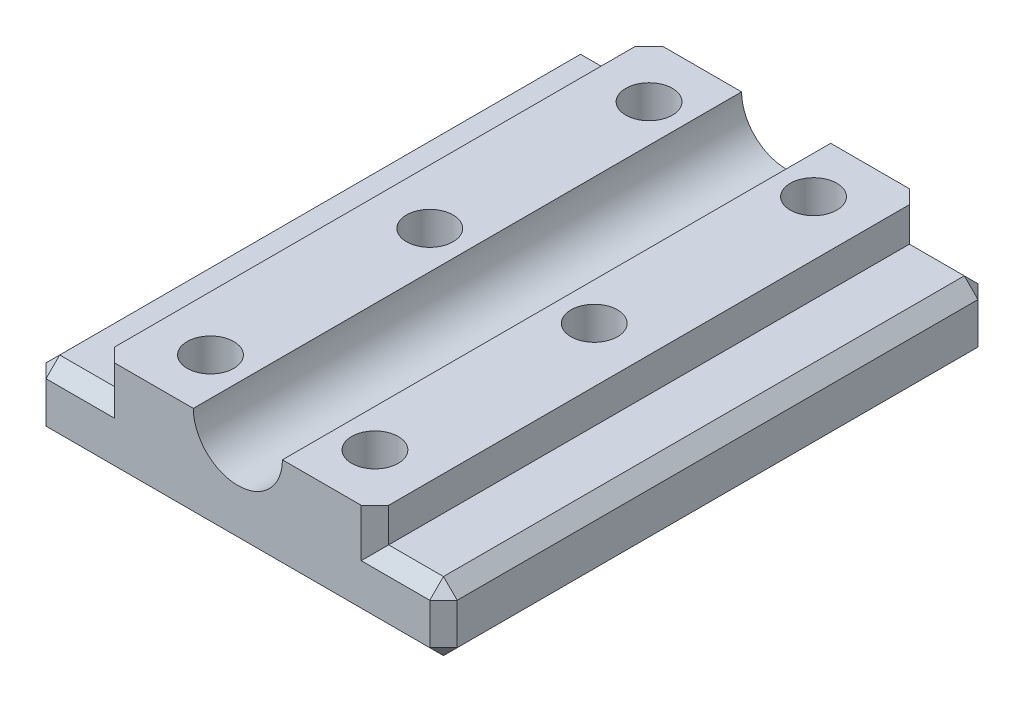
ISO-10303-21;
HEADER;
FILE_DESCRIPTION(('STEP AP214'),'2;1');
FILE_NAME('part.step','',(''),(''),'','','');
FILE_SCHEMA(('AUTOMOTIVE_DESIGN { 1 0 10303 214 1 1 1 1 }'));
ENDSEC;
DATA;
#1=APPLICATION_CONTEXT('core data for automotive mechanical design processes');
#2=APPLICATION_PROTOCOL_DEFINITION('international standard','automotive_design',2000,#1);
#3=PRODUCT_CONTEXT('',#1,'mechanical');
#4=PRODUCT('Part','Part','',(#3));
#5=PRODUCT_RELATED_PRODUCT_CATEGORY('part','',(#4));
#6=PRODUCT_DEFINITION_FORMATION('','',#4);
#7=PRODUCT_DEFINITION_CONTEXT('part definition',#1,'design');
#8=PRODUCT_DEFINITION('design','',#6,#7);
#9=PRODUCT_DEFINITION_SHAPE('','',#8);
#10=(LENGTH_UNIT() NAMED_UNIT(*) SI_UNIT(.MILLI.,.METRE.));
#11=(NAMED_UNIT(*) PLANE_ANGLE_UNIT() SI_UNIT($,.RADIAN.));
#12=(NAMED_UNIT(*) SI_UNIT($,.STERADIAN.) SOLID_ANGLE_UNIT());
#13=UNCERTAINTY_MEASURE_WITH_UNIT(LENGTH_MEASURE(1.E-05),#10,'distance_accuracy_value','');
#14=(GEOMETRIC_REPRESENTATION_CONTEXT(3) GLOBAL_UNCERTAINTY_ASSIGNED_CONTEXT((#13)) GLOBAL_UNIT_ASSIGNED_CONTEXT((#10,
#11,#12)) REPRESENTATION_CONTEXT('',''));
#15=CARTESIAN_POINT('',(0.,0.,0.));
#16=DIRECTION('',(0.,0.,1.));
#17=DIRECTION('',(1.,0.,0.));
#18=AXIS2_PLACEMENT_3D('',#15,#16,#17);
#19=CARTESIAN_POINT('',(0.,0.,0.));
#20=DIRECTION('',(0.,1.,0.));
#21=DIRECTION('',(0.,0.,1.));
#22=AXIS2_PLACEMENT_3D('',#19,#20,#21);
#23=PLANE('',#22);
#24=CARTESIAN_POINT('',(6.,0.,36.));
#25=DIRECTION('',(0.,1.,0.));
#26=DIRECTION('',(0.,0.,1.));
#27=AXIS2_PLACEMENT_3D('',#24,#25,#26);
#28=CIRCLE('',#27,1.7);
#29=CARTESIAN_POINT('',(6.,0.,37.7));
#30=VERTEX_POINT('',#29);
#31=EDGE_CURVE('E264',#30,#30,#28,.F.);
#32=ORIENTED_EDGE('',*,*,#31,.T.);
#33=EDGE_LOOP('',(#32));
#34=FACE_BOUND('',#33,.T.);
#35=CARTESIAN_POINT('',(6.,0.,4.));
#36=DIRECTION('',(0.,1.,0.));
#37=DIRECTION('',(0.,0.,1.));
#38=AXIS2_PLACEMENT_3D('',#35,#36,#37);
#39=CIRCLE('',#38,1.7);
#40=CARTESIAN_POINT('',(6.,0.,5.7));
#41=VERTEX_POINT('',#40);
#42=EDGE_CURVE('E252',#41,#41,#39,.F.);
#43=ORIENTED_EDGE('',*,*,#42,.T.);
#44=EDGE_LOOP('',(#43));
#45=FACE_BOUND('',#44,.T.);
#46=DIRECTION('',(0.,0.,-1.));
#47=VECTOR('',#46,1.);
#48=CARTESIAN_POINT('',(3.25,0.,40.));
#49=LINE('',#48,#47);
#50=CARTESIAN_POINT('',(3.25,0.,40.));
#51=VERTEX_POINT('',#50);
#52=CARTESIAN_POINT('',(3.25,0.,0.));
#53=VERTEX_POINT('',#52);
#54=EDGE_CURVE('E211',#51,#53,#49,.T.);
#55=ORIENTED_EDGE('',*,*,#54,.F.);
#56=DIRECTION('',(1.,0.,0.));
#57=VECTOR('',#56,1.);
#58=CARTESIAN_POINT('',(0.,0.,40.));
#59=LINE('',#58,#57);
#60=CARTESIAN_POINT('',(9.,0.,40.));
#61=VERTEX_POINT('',#60);
#62=EDGE_CURVE('E273',#51,#61,#59,.T.);
#63=ORIENTED_EDGE('',*,*,#62,.T.);
#64=DIRECTION('',(0.707106781186548,0.,-0.707106781186548));
#65=VECTOR('',#64,1.);
#66=CARTESIAN_POINT('',(9.,0.,40.));
#67=LINE('',#66,#65);
#68=CARTESIAN_POINT('',(10.,0.,39.));
#69=VERTEX_POINT('',#68);
#70=EDGE_CURVE('E210',#69,#61,#67,.F.);
#71=ORIENTED_EDGE('',*,*,#70,.F.);
#72=DIRECTION('',(0.,0.,-1.));
#73=VECTOR('',#72,1.);
#74=CARTESIAN_POINT('',(10.,0.,40.));
#75=LINE('',#74,#73);
#76=CARTESIAN_POINT('',(10.,0.,0.999999999999994));
#77=VERTEX_POINT('',#76);
#78=EDGE_CURVE('E220',#69,#77,#75,.T.);
#79=ORIENTED_EDGE('',*,*,#78,.T.);
#80=DIRECTION('',(0.707106781186548,0.,0.707106781186548));
#81=VECTOR('',#80,1.);
#82=CARTESIAN_POINT('',(10.,0.,0.999999999999994));
#83=LINE('',#82,#81);
#84=CARTESIAN_POINT('',(9.,0.,0.));
#85=VERTEX_POINT('',#84);
#86=EDGE_CURVE('E280',#85,#77,#83,.T.);
#87=ORIENTED_EDGE('',*,*,#86,.F.);
#88=DIRECTION('',(1.,0.,0.));
#89=VECTOR('',#88,1.);
#90=CARTESIAN_POINT('',(0.,0.,0.));
#91=LINE('',#90,#89);
#92=EDGE_CURVE('E219',#53,#85,#91,.T.);
#93=ORIENTED_EDGE('',*,*,#92,.F.);
#94=EDGE_LOOP('',(#55,#63,#71,#79,#87,#93));
#95=FACE_BOUND('',#94,.T.);
#96=CARTESIAN_POINT('',(6.,0.,20.));
#97=DIRECTION('',(0.,1.,0.));
#98=DIRECTION('',(0.,0.,1.));
#99=AXIS2_PLACEMENT_3D('',#96,#97,#98);
#100=CIRCLE('',#99,1.7);
#101=CARTESIAN_POINT('',(6.,0.,21.7));
#102=VERTEX_POINT('',#101);
#103=EDGE_CURVE('E258',#102,#102,#100,.F.);
#104=ORIENTED_EDGE('',*,*,#103,.T.);
#105=EDGE_LOOP('',(#104));
#106=FACE_BOUND('',#105,.T.);
#107=ADVANCED_FACE('F45',(#34,#45,#95,#106),#23,.T.);
#108=CARTESIAN_POINT('',(-6.,0.,36.));
#109=DIRECTION('',(0.,1.,0.));
#110=DIRECTION('',(0.,0.,1.));
#111=AXIS2_PLACEMENT_3D('',#108,#109,#110);
#112=CIRCLE('',#111,1.7);
#113=CARTESIAN_POINT('',(-6.,0.,37.7));
#114=VERTEX_POINT('',#113);
#115=EDGE_CURVE('E267',#114,#114,#112,.F.);
#116=ORIENTED_EDGE('',*,*,#115,.T.);
#117=EDGE_LOOP('',(#116));
#118=FACE_BOUND('',#117,.T.);
#119=CARTESIAN_POINT('',(-6.,0.,4.));
#120=DIRECTION('',(0.,1.,0.));
#121=DIRECTION('',(0.,0.,1.));
#122=AXIS2_PLACEMENT_3D('',#119,#120,#121);
#123=CIRCLE('',#122,1.7);
#124=CARTESIAN_POINT('',(-6.,0.,5.7));
#125=VERTEX_POINT('',#124);
#126=EDGE_CURVE('E255',#125,#125,#123,.F.);
#127=ORIENTED_EDGE('',*,*,#126,.T.);
#128=EDGE_LOOP('',(#127));
#129=FACE_BOUND('',#128,.T.);
#130=DIRECTION('',(0.707106781186548,0.,0.707106781186548));
#131=VECTOR('',#130,1.);
#132=CARTESIAN_POINT('',(-9.00000000000001,0.,40.));
#133=LINE('',#132,#131);
#134=CARTESIAN_POINT('',(-9.00000000000001,0.,40.));
#135=VERTEX_POINT('',#134);
#136=CARTESIAN_POINT('',(-10.,0.,39.));
#137=VERTEX_POINT('',#136);
#138=EDGE_CURVE('E282',#135,#137,#133,.F.);
#139=ORIENTED_EDGE('',*,*,#138,.F.);
#140=CARTESIAN_POINT('',(-3.25,0.,40.));
#141=VERTEX_POINT('',#140);
#142=EDGE_CURVE('E205',#135,#141,#59,.T.);
#143=ORIENTED_EDGE('',*,*,#142,.T.);
#144=DIRECTION('',(0.,0.,-1.));
#145=VECTOR('',#144,1.);
#146=CARTESIAN_POINT('',(-3.25,0.,40.));
#147=LINE('',#146,#145);
#148=CARTESIAN_POINT('',(-3.25,0.,0.));
#149=VERTEX_POINT('',#148);
#150=EDGE_CURVE('E198',#149,#141,#147,.F.);
#151=ORIENTED_EDGE('',*,*,#150,.F.);
#152=CARTESIAN_POINT('',(-9.00000000000001,0.,0.));
#153=VERTEX_POINT('',#152);
#154=EDGE_CURVE('E202',#153,#149,#91,.T.);
#155=ORIENTED_EDGE('',*,*,#154,.F.);
#156=DIRECTION('',(0.707106781186548,0.,-0.707106781186548));
#157=VECTOR('',#156,1.);
#158=CARTESIAN_POINT('',(-10.,0.,0.999999999999994));
#159=LINE('',#158,#157);
#160=CARTESIAN_POINT('',(-10.,0.,0.999999999999994));
#161=VERTEX_POINT('',#160);
#162=EDGE_CURVE('E284',#161,#153,#159,.T.);
#163=ORIENTED_EDGE('',*,*,#162,.F.);
#164=DIRECTION('',(0.,0.,1.));
#165=VECTOR('',#164,1.);
#166=CARTESIAN_POINT('',(-10.,0.,40.));
#167=LINE('',#166,#165);
#168=EDGE_CURVE('E270',#161,#137,#167,.T.);
#169=ORIENTED_EDGE('',*,*,#168,.T.);
#170=EDGE_LOOP('',(#139,#143,#151,#155,#163,#169));
#171=FACE_BOUND('',#170,.T.);
#172=CARTESIAN_POINT('',(-6.,0.,20.));
#173=DIRECTION('',(0.,1.,0.));
#174=DIRECTION('',(0.,0.,1.));
#175=AXIS2_PLACEMENT_3D('',#172,#173,#174);
#176=CIRCLE('',#175,1.7);
#177=CARTESIAN_POINT('',(-6.,0.,21.7));
#178=VERTEX_POINT('',#177);
#179=EDGE_CURVE('E261',#178,#178,#176,.F.);
#180=ORIENTED_EDGE('',*,*,#179,.T.);
#181=EDGE_LOOP('',(#180));
#182=FACE_BOUND('',#181,.T.);
#183=ADVANCED_FACE('F200',(#118,#129,#171,#182),#23,.T.);
#184=CARTESIAN_POINT('',(15.,-3.49999999999999,-7.07106781186548));
#185=DIRECTION('',(-0.707106781186547,-0.707106781186547,0.));
#186=DIRECTION('',(0.,0.,1.));
#187=AXIS2_PLACEMENT_3D('',#184,#185,#186);
#188=PLANE('',#187);
#189=DIRECTION('',(0.707106781186547,-0.707106781186547,0.));
#190=VECTOR('',#189,1.);
#191=CARTESIAN_POINT('',(14.5,-3.,39.));
#192=LINE('',#191,#190);
#193=CARTESIAN_POINT('',(14.,-2.5,39.));
#194=VERTEX_POINT('',#193);
#195=CARTESIAN_POINT('',(15.,-3.49999999999999,39.));
#196=VERTEX_POINT('',#195);
#197=EDGE_CURVE('E427',#194,#196,#192,.T.);
#198=ORIENTED_EDGE('',*,*,#197,.T.);
#199=DIRECTION('',(0.,0.,1.));
#200=VECTOR('',#199,1.);
#201=CARTESIAN_POINT('',(15.,-3.49999999999999,-7.07106781186548));
#202=LINE('',#201,#200);
#203=CARTESIAN_POINT('',(15.,-3.49999999999999,0.999999999999994));
#204=VERTEX_POINT('',#203);
#205=EDGE_CURVE('E251',#204,#196,#202,.T.);
#206=ORIENTED_EDGE('',*,*,#205,.F.);
#207=DIRECTION('',(-0.707106781186547,0.707106781186547,0.));
#208=VECTOR('',#207,1.);
#209=CARTESIAN_POINT('',(15.,-3.49999999999999,0.999999999999994));
#210=LINE('',#209,#208);
#211=CARTESIAN_POINT('',(14.,-2.5,0.999999999999994));
#212=VERTEX_POINT('',#211);
#213=EDGE_CURVE('E413',#212,#204,#210,.F.);
#214=ORIENTED_EDGE('',*,*,#213,.F.);
#215=DIRECTION('',(0.,0.,-1.));
#216=VECTOR('',#215,1.);
#217=CARTESIAN_POINT('',(14.,-2.5,-7.07106781186548));
#218=LINE('',#217,#216);
#219=EDGE_CURVE('E333',#194,#212,#218,.T.);
#220=ORIENTED_EDGE('',*,*,#219,.F.);
#221=EDGE_LOOP('',(#198,#206,#214,#220));
#222=FACE_BOUND('',#221,.T.);
#223=ADVANCED_FACE('F446',(#222),#188,.F.);
#224=CARTESIAN_POINT('',(14.,-6.50000000000001,40.));
#225=DIRECTION('',(0.577350269189626,-0.577350269189625,0.577350269189626));
#226=DIRECTION('',(0.707106781186548,0.,-0.707106781186548));
#227=AXIS2_PLACEMENT_3D('',#224,#225,#226);
#228=PLANE('',#227);
#229=DIRECTION('',(0.707106781186547,0.707106781186548,0.));
#230=VECTOR('',#229,1.);
#231=CARTESIAN_POINT('',(14.5,-7.,39.));
#232=LINE('',#231,#230);
#233=CARTESIAN_POINT('',(15.,-6.50000000000001,39.));
#234=VERTEX_POINT('',#233);
#235=CARTESIAN_POINT('',(14.,-7.5,39.));
#236=VERTEX_POINT('',#235);
#237=EDGE_CURVE('E418',#234,#236,#232,.F.);
#238=ORIENTED_EDGE('',*,*,#237,.F.);
#239=DIRECTION('',(-0.707106781186547,0.,0.707106781186547));
#240=VECTOR('',#239,1.);
#241=CARTESIAN_POINT('',(14.,-6.50000000000001,40.));
#242=LINE('',#241,#240);
#243=CARTESIAN_POINT('',(14.,-6.50000000000001,40.));
#244=VERTEX_POINT('',#243);
#245=EDGE_CURVE('E430',#234,#244,#242,.T.);
#246=ORIENTED_EDGE('',*,*,#245,.T.);
#247=DIRECTION('',(0.,0.707106781186547,0.707106781186547));
#248=VECTOR('',#247,1.);
#249=CARTESIAN_POINT('',(14.,-6.50000000000001,40.));
#250=LINE('',#249,#248);
#251=EDGE_CURVE('E421',#236,#244,#250,.T.);
#252=ORIENTED_EDGE('',*,*,#251,.F.);
#253=EDGE_LOOP('',(#238,#246,#252));
#254=FACE_BOUND('',#253,.T.);
#255=ADVANCED_FACE('F467',(#254),#228,.T.);
#256=CARTESIAN_POINT('',(-15.,-6.50000000000001,39.));
#257=DIRECTION('',(-0.577350269189626,-0.577350269189626,0.577350269189626));
#258=DIRECTION('',(0.707106781186547,0.,0.707106781186547));
#259=AXIS2_PLACEMENT_3D('',#256,#257,#258);
#260=PLANE('',#259);
#261=DIRECTION('',(-0.707106781186547,0.707106781186547,0.));
#262=VECTOR('',#261,1.);
#263=CARTESIAN_POINT('',(-15.,-6.50000000000001,39.));
#264=LINE('',#263,#262);
#265=CARTESIAN_POINT('',(-14.,-7.5,39.));
#266=VERTEX_POINT('',#265);
#267=CARTESIAN_POINT('',(-15.,-6.50000000000001,39.));
#268=VERTEX_POINT('',#267);
#269=EDGE_CURVE('E392',#266,#268,#264,.T.);
#270=ORIENTED_EDGE('',*,*,#269,.F.);
#271=DIRECTION('',(0.,-0.707106781186547,-0.707106781186547));
#272=VECTOR('',#271,1.);
#273=CARTESIAN_POINT('',(-14.,-7.,39.5));
#274=LINE('',#273,#272);
#275=CARTESIAN_POINT('',(-14.,-6.50000000000001,40.));
#276=VERTEX_POINT('',#275);
#277=EDGE_CURVE('E407',#266,#276,#274,.F.);
#278=ORIENTED_EDGE('',*,*,#277,.T.);
#279=DIRECTION('',(0.707106781186547,0.,0.707106781186547));
#280=VECTOR('',#279,1.);
#281=CARTESIAN_POINT('',(-15.,-6.50000000000001,39.));
#282=LINE('',#281,#280);
#283=EDGE_CURVE('E395',#268,#276,#282,.T.);
#284=ORIENTED_EDGE('',*,*,#283,.F.);
#285=EDGE_LOOP('',(#270,#278,#284));
#286=FACE_BOUND('',#285,.T.);
#287=ADVANCED_FACE('F527',(#286),#260,.T.);
#288=CARTESIAN_POINT('',(-15.,-7.5,-7.07106781186548));
#289=DIRECTION('',(1.,0.,0.));
#290=DIRECTION('',(0.,0.,-1.));
#291=AXIS2_PLACEMENT_3D('',#288,#289,#290);
#292=PLANE('',#291);
#293=DIRECTION('',(0.,0.,-1.));
#294=VECTOR('',#293,1.);
#295=CARTESIAN_POINT('',(-15.,-3.49999999999999,-7.07106781186548));
#296=LINE('',#295,#294);
#297=CARTESIAN_POINT('',(-15.,-3.49999999999999,39.));
#298=VERTEX_POINT('',#297);
#299=CARTESIAN_POINT('',(-15.,-3.49999999999999,0.999999999999994));
#300=VERTEX_POINT('',#299);
#301=EDGE_CURVE('E353',#298,#300,#296,.T.);
#302=ORIENTED_EDGE('',*,*,#301,.T.);
#303=DIRECTION('',(0.,-1.,0.));
#304=VECTOR('',#303,1.);
#305=CARTESIAN_POINT('',(-15.,-7.5,0.999999999999994));
#306=LINE('',#305,#304);
#307=CARTESIAN_POINT('',(-15.,-6.50000000000001,0.999999999999994));
#308=VERTEX_POINT('',#307);
#309=EDGE_CURVE('E286',#300,#308,#306,.T.);
#310=ORIENTED_EDGE('',*,*,#309,.T.);
#311=DIRECTION('',(0.,0.,1.));
#312=VECTOR('',#311,1.);
#313=CARTESIAN_POINT('',(-15.,-6.50000000000001,-7.07106781186548));
#314=LINE('',#313,#312);
#315=EDGE_CURVE('E355',#308,#268,#314,.T.);
#316=ORIENTED_EDGE('',*,*,#315,.T.);
#317=DIRECTION('',(0.,1.,0.));
#318=VECTOR('',#317,1.);
#319=CARTESIAN_POINT('',(-15.,-7.5,39.));
#320=LINE('',#319,#318);
#321=EDGE_CURVE('E351',#268,#298,#320,.T.);
#322=ORIENTED_EDGE('',*,*,#321,.T.);
#323=EDGE_LOOP('',(#302,#310,#316,#322));
#324=FACE_BOUND('',#323,.T.);
#325=ADVANCED_FACE('F550',(#324),#292,.F.);
#326=CARTESIAN_POINT('',(-14.,-6.50000000000001,0.));
#327=DIRECTION('',(-0.577350269189626,-0.577350269189626,-0.577350269189626));
#328=DIRECTION('',(-0.707106781186547,0.,0.707106781186547));
#329=AXIS2_PLACEMENT_3D('',#326,#327,#328);
#330=PLANE('',#329);
#331=DIRECTION('',(0.,-0.707106781186547,0.707106781186547));
#332=VECTOR('',#331,1.);
#333=CARTESIAN_POINT('',(-14.,-6.50000000000001,0.));
#334=LINE('',#333,#332);
#335=CARTESIAN_POINT('',(-14.,-6.50000000000001,0.));
#336=VERTEX_POINT('',#335);
#337=CARTESIAN_POINT('',(-14.,-7.5,0.999999999999994));
#338=VERTEX_POINT('',#337);
#339=EDGE_CURVE('E372',#336,#338,#334,.T.);
#340=ORIENTED_EDGE('',*,*,#339,.T.);
#341=DIRECTION('',(0.707106781186547,-0.707106781186547,0.));
#342=VECTOR('',#341,1.);
#343=CARTESIAN_POINT('',(-14.5,-7.,0.999999999999994));
#344=LINE('',#343,#342);
#345=EDGE_CURVE('E375',#338,#308,#344,.F.);
#346=ORIENTED_EDGE('',*,*,#345,.T.);
#347=DIRECTION('',(0.707106781186547,0.,-0.707106781186547));
#348=VECTOR('',#347,1.);
#349=CARTESIAN_POINT('',(-14.,-6.50000000000001,0.));
#350=LINE('',#349,#348);
#351=EDGE_CURVE('E367',#336,#308,#350,.F.);
#352=ORIENTED_EDGE('',*,*,#351,.F.);
#353=EDGE_LOOP('',(#340,#346,#352));
#354=FACE_BOUND('',#353,.T.);
#355=ADVANCED_FACE('F535',(#354),#330,.T.);
#356=CARTESIAN_POINT('',(14.,-6.50000000000001,0.));
#357=DIRECTION('',(0.577350269189626,-0.577350269189625,-0.577350269189626));
#358=DIRECTION('',(-0.707106781186548,0.,-0.707106781186548));
#359=AXIS2_PLACEMENT_3D('',#356,#357,#358);
#360=PLANE('',#359);
#361=DIRECTION('',(-0.707106781186547,0.,-0.707106781186547));
#362=VECTOR('',#361,1.);
#363=CARTESIAN_POINT('',(14.,-6.50000000000001,0.));
#364=LINE('',#363,#362);
#365=CARTESIAN_POINT('',(14.,-6.50000000000001,0.));
#366=VERTEX_POINT('',#365);
#367=CARTESIAN_POINT('',(15.,-6.50000000000001,0.999999999999994));
#368=VERTEX_POINT('',#367);
#369=EDGE_CURVE('E401',#366,#368,#364,.F.);
#370=ORIENTED_EDGE('',*,*,#369,.T.);
#371=DIRECTION('',(-0.707106781186547,-0.707106781186548,0.));
#372=VECTOR('',#371,1.);
#373=CARTESIAN_POINT('',(14.5,-7.,0.999999999999994));
#374=LINE('',#373,#372);
#375=CARTESIAN_POINT('',(14.,-7.5,0.999999999999994));
#376=VERTEX_POINT('',#375);
#377=EDGE_CURVE('E404',#368,#376,#374,.T.);
#378=ORIENTED_EDGE('',*,*,#377,.T.);
#379=DIRECTION('',(0.,0.707106781186547,-0.707106781186547));
#380=VECTOR('',#379,1.);
#381=CARTESIAN_POINT('',(14.,-6.50000000000001,0.));
#382=LINE('',#381,#380);
#383=EDGE_CURVE('E390',#366,#376,#382,.F.);
#384=ORIENTED_EDGE('',*,*,#383,.F.);
#385=EDGE_LOOP('',(#370,#378,#384));
#386=FACE_BOUND('',#385,.T.);
#387=ADVANCED_FACE('F541',(#386),#360,.T.);
#388=CARTESIAN_POINT('',(15.,-7.5,-7.07106781186548));
#389=DIRECTION('',(1.,0.,0.));
#390=DIRECTION('',(0.,0.,-1.));
#391=AXIS2_PLACEMENT_3D('',#388,#389,#390);
#392=PLANE('',#391);
#393=DIRECTION('',(0.,0.,-1.));
#394=VECTOR('',#393,1.);
#395=CARTESIAN_POINT('',(15.,-6.50000000000001,0.));
#396=LINE('',#395,#394);
#397=EDGE_CURVE('E326',#234,#368,#396,.T.);
#398=ORIENTED_EDGE('',*,*,#397,.T.);
#399=DIRECTION('',(0.,1.,0.));
#400=VECTOR('',#399,1.);
#401=CARTESIAN_POINT('',(15.,-7.5,0.999999999999994));
#402=LINE('',#401,#400);
#403=EDGE_CURVE('E328',#368,#204,#402,.T.);
#404=ORIENTED_EDGE('',*,*,#403,.T.);
#405=ORIENTED_EDGE('',*,*,#205,.T.);
#406=DIRECTION('',(0.,-1.,0.));
#407=VECTOR('',#406,1.);
#408=CARTESIAN_POINT('',(15.,-7.5,39.));
#409=LINE('',#408,#407);
#410=EDGE_CURVE('E324',#196,#234,#409,.T.);
#411=ORIENTED_EDGE('',*,*,#410,.T.);
#412=EDGE_LOOP('',(#398,#404,#405,#411));
#413=FACE_BOUND('',#412,.T.);
#414=ADVANCED_FACE('F485',(#413),#392,.T.);
#415=CARTESIAN_POINT('',(-14.,-2.5,-7.07106781186548));
#416=DIRECTION('',(0.707106781186547,-0.707106781186547,0.));
#417=DIRECTION('',(0.,0.,1.));
#418=AXIS2_PLACEMENT_3D('',#415,#416,#417);
#419=PLANE('',#418);
#420=DIRECTION('',(0.707106781186547,0.707106781186547,0.));
#421=VECTOR('',#420,1.);
#422=CARTESIAN_POINT('',(-14.,-2.5,39.));
#423=LINE('',#422,#421);
#424=CARTESIAN_POINT('',(-14.,-2.5,39.));
#425=VERTEX_POINT('',#424);
#426=EDGE_CURVE('E369',#298,#425,#423,.T.);
#427=ORIENTED_EDGE('',*,*,#426,.T.);
#428=DIRECTION('',(0.,0.,1.));
#429=VECTOR('',#428,1.);
#430=CARTESIAN_POINT('',(-14.,-2.5,-7.07106781186548));
#431=LINE('',#430,#429);
#432=CARTESIAN_POINT('',(-14.,-2.5,0.999999999999994));
#433=VERTEX_POINT('',#432);
#434=EDGE_CURVE('E347',#433,#425,#431,.T.);
#435=ORIENTED_EDGE('',*,*,#434,.F.);
#436=DIRECTION('',(-0.707106781186547,-0.707106781186547,0.));
#437=VECTOR('',#436,1.);
#438=CARTESIAN_POINT('',(-14.,-2.5,0.999999999999994));
#439=LINE('',#438,#437);
#440=EDGE_CURVE('E364',#300,#433,#439,.F.);
#441=ORIENTED_EDGE('',*,*,#440,.F.);
#442=ORIENTED_EDGE('',*,*,#301,.F.);
#443=EDGE_LOOP('',(#427,#435,#441,#442));
#444=FACE_BOUND('',#443,.T.);
#445=ADVANCED_FACE('F548',(#444),#419,.F.);
#446=CARTESIAN_POINT('',(14.,-7.5,40.));
#447=DIRECTION('',(0.707106781186548,-0.707106781186547,0.));
#448=DIRECTION('',(0.,0.,-1.));
#449=AXIS2_PLACEMENT_3D('',#446,#447,#448);
#450=PLANE('',#449);
#451=ORIENTED_EDGE('',*,*,#237,.T.);
#452=DIRECTION('',(0.,0.,1.));
#453=VECTOR('',#452,1.);
#454=CARTESIAN_POINT('',(14.,-7.5,40.));
#455=LINE('',#454,#453);
#456=EDGE_CURVE('E337',#376,#236,#455,.T.);
#457=ORIENTED_EDGE('',*,*,#456,.F.);
#458=ORIENTED_EDGE('',*,*,#377,.F.);
#459=ORIENTED_EDGE('',*,*,#397,.F.);
#460=EDGE_LOOP('',(#451,#457,#458,#459));
#461=FACE_BOUND('',#460,.T.);
#462=ADVANCED_FACE('F482',(#461),#450,.T.);
#463=CARTESIAN_POINT('',(14.,-3.49999999999999,40.));
#464=DIRECTION('',(0.577350269189626,0.577350269189626,0.577350269189626));
#465=DIRECTION('',(0.707106781186547,0.,-0.707106781186547));
#466=AXIS2_PLACEMENT_3D('',#463,#464,#465);
#467=PLANE('',#466);
#468=DIRECTION('',(0.,-0.707106781186547,0.707106781186547));
#469=VECTOR('',#468,1.);
#470=CARTESIAN_POINT('',(14.,-3.49999999999999,40.));
#471=LINE('',#470,#469);
#472=CARTESIAN_POINT('',(14.,-3.49999999999999,40.));
#473=VERTEX_POINT('',#472);
#474=EDGE_CURVE('E424',#473,#194,#471,.F.);
#475=ORIENTED_EDGE('',*,*,#474,.F.);
#476=DIRECTION('',(0.707106781186547,0.,-0.707106781186547));
#477=VECTOR('',#476,1.);
#478=CARTESIAN_POINT('',(14.,-3.49999999999999,40.));
#479=LINE('',#478,#477);
#480=EDGE_CURVE('E289',#473,#196,#479,.T.);
#481=ORIENTED_EDGE('',*,*,#480,.T.);
#482=ORIENTED_EDGE('',*,*,#197,.F.);
#483=EDGE_LOOP('',(#475,#481,#482));
#484=FACE_BOUND('',#483,.T.);
#485=ADVANCED_FACE('F438',(#484),#467,.T.);
#486=CARTESIAN_POINT('',(15.,-3.49999999999999,0.999999999999994));
#487=DIRECTION('',(0.577350269189626,0.577350269189626,-0.577350269189626));
#488=DIRECTION('',(-0.707106781186547,0.,-0.707106781186547));
#489=AXIS2_PLACEMENT_3D('',#486,#487,#488);
#490=PLANE('',#489);
#491=ORIENTED_EDGE('',*,*,#213,.T.);
#492=DIRECTION('',(0.707106781186547,0.,0.707106781186547));
#493=VECTOR('',#492,1.);
#494=CARTESIAN_POINT('',(15.,-3.49999999999999,0.999999999999994));
#495=LINE('',#494,#493);
#496=CARTESIAN_POINT('',(14.,-3.49999999999999,0.));
#497=VERTEX_POINT('',#496);
#498=EDGE_CURVE('E415',#204,#497,#495,.F.);
#499=ORIENTED_EDGE('',*,*,#498,.T.);
#500=DIRECTION('',(0.,-0.707106781186547,-0.707106781186547));
#501=VECTOR('',#500,1.);
#502=CARTESIAN_POINT('',(14.,-3.,0.499999999999997));
#503=LINE('',#502,#501);
#504=EDGE_CURVE('E398',#212,#497,#503,.T.);
#505=ORIENTED_EDGE('',*,*,#504,.F.);
#506=EDGE_LOOP('',(#491,#499,#505));
#507=FACE_BOUND('',#506,.T.);
#508=ADVANCED_FACE('F493',(#507),#490,.T.);
#509=CARTESIAN_POINT('',(-14.,-2.5,39.));
#510=DIRECTION('',(-0.577350269189626,0.577350269189626,0.577350269189626));
#511=DIRECTION('',(0.707106781186547,0.,0.707106781186547));
#512=AXIS2_PLACEMENT_3D('',#509,#510,#511);
#513=PLANE('',#512);
#514=DIRECTION('',(-0.707106781186547,0.,-0.707106781186547));
#515=VECTOR('',#514,1.);
#516=CARTESIAN_POINT('',(-14.5,-3.49999999999999,39.5));
#517=LINE('',#516,#515);
#518=CARTESIAN_POINT('',(-14.,-3.49999999999999,40.));
#519=VERTEX_POINT('',#518);
#520=EDGE_CURVE('E378',#298,#519,#517,.F.);
#521=ORIENTED_EDGE('',*,*,#520,.T.);
#522=DIRECTION('',(0.,-0.707106781186547,0.707106781186547));
#523=VECTOR('',#522,1.);
#524=CARTESIAN_POINT('',(-14.,-2.5,39.));
#525=LINE('',#524,#523);
#526=EDGE_CURVE('E381',#519,#425,#525,.F.);
#527=ORIENTED_EDGE('',*,*,#526,.T.);
#528=ORIENTED_EDGE('',*,*,#426,.F.);
#529=EDGE_LOOP('',(#521,#527,#528));
#530=FACE_BOUND('',#529,.T.);
#531=ADVANCED_FACE('F596',(#530),#513,.T.);
#532=CARTESIAN_POINT('',(-14.,-2.5,0.999999999999994));
#533=DIRECTION('',(-0.577350269189626,0.577350269189626,-0.577350269189626));
#534=DIRECTION('',(-0.707106781186547,0.,0.707106781186547));
#535=AXIS2_PLACEMENT_3D('',#532,#533,#534);
#536=PLANE('',#535);
#537=DIRECTION('',(-0.707106781186547,0.,0.707106781186547));
#538=VECTOR('',#537,1.);
#539=CARTESIAN_POINT('',(-14.5,-3.49999999999999,0.499999999999997));
#540=LINE('',#539,#538);
#541=CARTESIAN_POINT('',(-14.,-3.49999999999999,0.));
#542=VERTEX_POINT('',#541);
#543=EDGE_CURVE('E361',#542,#300,#540,.T.);
#544=ORIENTED_EDGE('',*,*,#543,.T.);
#545=ORIENTED_EDGE('',*,*,#440,.T.);
#546=DIRECTION('',(0.,-0.707106781186547,-0.707106781186547));
#547=VECTOR('',#546,1.);
#548=CARTESIAN_POINT('',(-14.,-2.5,0.999999999999994));
#549=LINE('',#548,#547);
#550=EDGE_CURVE('E55',#542,#433,#549,.F.);
#551=ORIENTED_EDGE('',*,*,#550,.F.);
#552=EDGE_LOOP('',(#544,#545,#551));
#553=FACE_BOUND('',#552,.T.);
#554=ADVANCED_FACE('F761',(#553),#536,.T.);
#555=CARTESIAN_POINT('',(10.,-2.5,-7.07106781186548));
#556=DIRECTION('',(0.,1.,0.));
#557=DIRECTION('',(0.,0.,1.));
#558=AXIS2_PLACEMENT_3D('',#555,#556,#557);
#559=PLANE('',#558);
#560=ORIENTED_EDGE('',*,*,#219,.T.);
#561=DIRECTION('',(-1.,0.,0.));
#562=VECTOR('',#561,1.);
#563=CARTESIAN_POINT('',(10.,-2.5,0.999999999999994));
#564=LINE('',#563,#562);
#565=CARTESIAN_POINT('',(10.,-2.5,0.999999999999994));
#566=VERTEX_POINT('',#565);
#567=EDGE_CURVE('E335',#212,#566,#564,.T.);
#568=ORIENTED_EDGE('',*,*,#567,.T.);
#569=DIRECTION('',(0.,0.,1.));
#570=VECTOR('',#569,1.);
#571=CARTESIAN_POINT('',(10.,-2.5,-7.07106781186548));
#572=LINE('',#571,#570);
#573=CARTESIAN_POINT('',(10.,-2.5,39.));
#574=VERTEX_POINT('',#573);
#575=EDGE_CURVE('E290',#566,#574,#572,.T.);
#576=ORIENTED_EDGE('',*,*,#575,.T.);
#577=DIRECTION('',(1.,0.,0.));
#578=VECTOR('',#577,1.);
#579=CARTESIAN_POINT('',(15.,-2.5,39.));
#580=LINE('',#579,#578);
#581=EDGE_CURVE('E331',#574,#194,#580,.T.);
#582=ORIENTED_EDGE('',*,*,#581,.T.);
#583=EDGE_LOOP('',(#560,#568,#576,#582));
#584=FACE_BOUND('',#583,.T.);
#585=ADVANCED_FACE('F450',(#584),#559,.T.);
#586=CARTESIAN_POINT('',(14.,0.,40.));
#587=DIRECTION('',(0.707106781186547,0.,0.707106781186547));
#588=DIRECTION('',(0.,-1.,0.));
#589=AXIS2_PLACEMENT_3D('',#586,#587,#588);
#590=PLANE('',#589);
#591=ORIENTED_EDGE('',*,*,#480,.F.);
#592=DIRECTION('',(0.,1.,0.));
#593=VECTOR('',#592,1.);
#594=CARTESIAN_POINT('',(14.,-2.5,40.));
#595=LINE('',#594,#593);
#596=EDGE_CURVE('E316',#244,#473,#595,.T.);
#597=ORIENTED_EDGE('',*,*,#596,.F.);
#598=ORIENTED_EDGE('',*,*,#245,.F.);
#599=ORIENTED_EDGE('',*,*,#410,.F.);
#600=EDGE_LOOP('',(#591,#597,#598,#599));
#601=FACE_BOUND('',#600,.T.);
#602=ADVANCED_FACE('F463',(#601),#590,.T.);
#603=CARTESIAN_POINT('',(0.,-6.50000000000001,40.));
#604=DIRECTION('',(0.,0.707106781186547,-0.707106781186547));
#605=DIRECTION('',(1.,0.,0.));
#606=AXIS2_PLACEMENT_3D('',#603,#604,#605);
#607=PLANE('',#606);
#608=ORIENTED_EDGE('',*,*,#251,.T.);
#609=DIRECTION('',(1.,0.,0.));
#610=VECTOR('',#609,1.);
#611=CARTESIAN_POINT('',(0.,-6.50000000000001,40.));
#612=LINE('',#611,#610);
#613=EDGE_CURVE('E318',#276,#244,#612,.T.);
#614=ORIENTED_EDGE('',*,*,#613,.F.);
#615=ORIENTED_EDGE('',*,*,#277,.F.);
#616=DIRECTION('',(-1.,0.,0.));
#617=VECTOR('',#616,1.);
#618=CARTESIAN_POINT('',(-10.,-7.5,39.));
#619=LINE('',#618,#617);
#620=EDGE_CURVE('E339',#236,#266,#619,.T.);
#621=ORIENTED_EDGE('',*,*,#620,.F.);
#622=EDGE_LOOP('',(#608,#614,#615,#621));
#623=FACE_BOUND('',#622,.T.);
#624=ADVANCED_FACE('F471',(#623),#607,.F.);
#625=CARTESIAN_POINT('',(-15.,-7.5,39.));
#626=DIRECTION('',(0.707106781186547,0.,-0.707106781186547));
#627=DIRECTION('',(0.,1.,0.));
#628=AXIS2_PLACEMENT_3D('',#625,#626,#627);
#629=PLANE('',#628);
#630=ORIENTED_EDGE('',*,*,#283,.T.);
#631=DIRECTION('',(0.,-1.,0.));
#632=VECTOR('',#631,1.);
#633=CARTESIAN_POINT('',(-14.,0.,40.));
#634=LINE('',#633,#632);
#635=EDGE_CURVE('E320',#519,#276,#634,.T.);
#636=ORIENTED_EDGE('',*,*,#635,.F.);
#637=ORIENTED_EDGE('',*,*,#520,.F.);
#638=ORIENTED_EDGE('',*,*,#321,.F.);
#639=EDGE_LOOP('',(#630,#636,#637,#638));
#640=FACE_BOUND('',#639,.T.);
#641=ADVANCED_FACE('F522',(#640),#629,.F.);
#642=CARTESIAN_POINT('',(-15.,-7.5,0.999999999999994));
#643=DIRECTION('',(-0.707106781186547,0.,-0.707106781186547));
#644=DIRECTION('',(0.,1.,0.));
#645=AXIS2_PLACEMENT_3D('',#642,#643,#644);
#646=PLANE('',#645);
#647=ORIENTED_EDGE('',*,*,#351,.T.);
#648=ORIENTED_EDGE('',*,*,#309,.F.);
#649=ORIENTED_EDGE('',*,*,#543,.F.);
#650=DIRECTION('',(0.,1.,0.));
#651=VECTOR('',#650,1.);
#652=CARTESIAN_POINT('',(-14.,-2.5,0.));
#653=LINE('',#652,#651);
#654=EDGE_CURVE('E312',#336,#542,#653,.T.);
#655=ORIENTED_EDGE('',*,*,#654,.F.);
#656=EDGE_LOOP('',(#647,#648,#649,#655));
#657=FACE_BOUND('',#656,.T.);
#658=ADVANCED_FACE('F789',(#657),#646,.T.);
#659=CARTESIAN_POINT('',(-10.,-7.5,0.999999999999994));
#660=DIRECTION('',(0.,-0.707106781186547,-0.707106781186547));
#661=DIRECTION('',(-1.,0.,0.));
#662=AXIS2_PLACEMENT_3D('',#659,#660,#661);
#663=PLANE('',#662);
#664=ORIENTED_EDGE('',*,*,#383,.T.);
#665=DIRECTION('',(1.,0.,0.));
#666=VECTOR('',#665,1.);
#667=CARTESIAN_POINT('',(15.,-7.5,0.999999999999994));
#668=LINE('',#667,#666);
#669=EDGE_CURVE('E343',#338,#376,#668,.T.);
#670=ORIENTED_EDGE('',*,*,#669,.F.);
#671=ORIENTED_EDGE('',*,*,#339,.F.);
#672=DIRECTION('',(-1.,0.,0.));
#673=VECTOR('',#672,1.);
#674=CARTESIAN_POINT('',(-15.,-6.50000000000001,0.));
#675=LINE('',#674,#673);
#676=EDGE_CURVE('E240',#366,#336,#675,.T.);
#677=ORIENTED_EDGE('',*,*,#676,.F.);
#678=EDGE_LOOP('',(#664,#670,#671,#677));
#679=FACE_BOUND('',#678,.T.);
#680=ADVANCED_FACE('F539',(#679),#663,.T.);
#681=CARTESIAN_POINT('',(14.,0.,0.));
#682=DIRECTION('',(-0.707106781186547,0.,0.707106781186547));
#683=DIRECTION('',(0.,-1.,0.));
#684=AXIS2_PLACEMENT_3D('',#681,#682,#683);
#685=PLANE('',#684);
#686=ORIENTED_EDGE('',*,*,#498,.F.);
#687=ORIENTED_EDGE('',*,*,#403,.F.);
#688=ORIENTED_EDGE('',*,*,#369,.F.);
#689=DIRECTION('',(0.,-1.,0.));
#690=VECTOR('',#689,1.);
#691=CARTESIAN_POINT('',(14.,0.,0.));
#692=LINE('',#691,#690);
#693=EDGE_CURVE('E310',#497,#366,#692,.T.);
#694=ORIENTED_EDGE('',*,*,#693,.F.);
#695=EDGE_LOOP('',(#686,#687,#688,#694));
#696=FACE_BOUND('',#695,.T.);
#697=ADVANCED_FACE('F489',(#696),#685,.F.);
#698=CARTESIAN_POINT('',(-10.,-2.5,-7.07106781186548));
#699=DIRECTION('',(0.,-1.,0.));
#700=DIRECTION('',(0.,0.,-1.));
#701=AXIS2_PLACEMENT_3D('',#698,#699,#700);
#702=PLANE('',#701);
#703=DIRECTION('',(0.,0.,1.));
#704=VECTOR('',#703,1.);
#705=CARTESIAN_POINT('',(-10.,-2.5,-7.07106781186548));
#706=LINE('',#705,#704);
#707=CARTESIAN_POINT('',(-10.,-2.5,0.999999999999994));
#708=VERTEX_POINT('',#707);
#709=CARTESIAN_POINT('',(-10.,-2.5,39.));
#710=VERTEX_POINT('',#709);
#711=EDGE_CURVE('E287',#708,#710,#706,.T.);
#712=ORIENTED_EDGE('',*,*,#711,.F.);
#713=DIRECTION('',(-1.,0.,0.));
#714=VECTOR('',#713,1.);
#715=CARTESIAN_POINT('',(-15.,-2.5,0.999999999999994));
#716=LINE('',#715,#714);
#717=EDGE_CURVE('E349',#708,#433,#716,.T.);
#718=ORIENTED_EDGE('',*,*,#717,.T.);
#719=ORIENTED_EDGE('',*,*,#434,.T.);
#720=DIRECTION('',(1.,0.,0.));
#721=VECTOR('',#720,1.);
#722=CARTESIAN_POINT('',(-10.,-2.5,39.));
#723=LINE('',#722,#721);
#724=EDGE_CURVE('E70',#425,#710,#723,.T.);
#725=ORIENTED_EDGE('',*,*,#724,.T.);
#726=EDGE_LOOP('',(#712,#718,#719,#725));
#727=FACE_BOUND('',#726,.T.);
#728=ADVANCED_FACE('F576',(#727),#702,.F.);
#729=CARTESIAN_POINT('',(0.,-3.49999999999999,40.));
#730=DIRECTION('',(0.,0.707106781186547,0.707106781186547));
#731=DIRECTION('',(1.,0.,0.));
#732=AXIS2_PLACEMENT_3D('',#729,#730,#731);
#733=PLANE('',#732);
#734=ORIENTED_EDGE('',*,*,#474,.T.);
#735=ORIENTED_EDGE('',*,*,#581,.F.);
#736=DIRECTION('',(-0.577350269189626,-0.577350269189626,0.577350269189626));
#737=VECTOR('',#736,1.);
#738=CARTESIAN_POINT('',(6.,-6.5,43.));
#739=LINE('',#738,#737);
#740=CARTESIAN_POINT('',(9.,-3.49999999999999,40.));
#741=VERTEX_POINT('',#740);
#742=EDGE_CURVE('E410',#741,#574,#739,.F.);
#743=ORIENTED_EDGE('',*,*,#742,.F.);
#744=DIRECTION('',(-1.,0.,0.));
#745=VECTOR('',#744,1.);
#746=CARTESIAN_POINT('',(10.,-3.49999999999999,40.));
#747=LINE('',#746,#745);
#748=EDGE_CURVE('E247',#473,#741,#747,.T.);
#749=ORIENTED_EDGE('',*,*,#748,.F.);
#750=EDGE_LOOP('',(#734,#735,#743,#749));
#751=FACE_BOUND('',#750,.T.);
#752=ADVANCED_FACE('F456',(#751),#733,.T.);
#753=CARTESIAN_POINT('',(0.,-3.49999999999999,0.));
#754=DIRECTION('',(0.,-0.707106781186547,0.707106781186547));
#755=DIRECTION('',(1.,0.,0.));
#756=AXIS2_PLACEMENT_3D('',#753,#754,#755);
#757=PLANE('',#756);
#758=ORIENTED_EDGE('',*,*,#504,.T.);
#759=DIRECTION('',(1.,0.,0.));
#760=VECTOR('',#759,1.);
#761=CARTESIAN_POINT('',(0.,-3.49999999999999,0.));
#762=LINE('',#761,#760);
#763=CARTESIAN_POINT('',(9.,-3.49999999999999,0.));
#764=VERTEX_POINT('',#763);
#765=EDGE_CURVE('E308',#764,#497,#762,.T.);
#766=ORIENTED_EDGE('',*,*,#765,.F.);
#767=DIRECTION('',(-0.577350269189626,-0.577350269189626,-0.577350269189626));
#768=VECTOR('',#767,1.);
#769=CARTESIAN_POINT('',(8.33333333333333,-4.16666666666667,-0.666666666666673));
#770=LINE('',#769,#768);
#771=EDGE_CURVE('E387',#566,#764,#770,.T.);
#772=ORIENTED_EDGE('',*,*,#771,.F.);
#773=ORIENTED_EDGE('',*,*,#567,.F.);
#774=EDGE_LOOP('',(#758,#766,#772,#773));
#775=FACE_BOUND('',#774,.T.);
#776=ADVANCED_FACE('F496',(#775),#757,.F.);
#777=CARTESIAN_POINT('',(10.,-7.5,40.));
#778=DIRECTION('',(-1.,0.,0.));
#779=DIRECTION('',(0.,0.,1.));
#780=AXIS2_PLACEMENT_3D('',#777,#778,#779);
#781=PLANE('',#780);
#782=ORIENTED_EDGE('',*,*,#78,.F.);
#783=DIRECTION('',(0.,-1.,0.));
#784=VECTOR('',#783,1.);
#785=CARTESIAN_POINT('',(10.,-7.5,39.));
#786=LINE('',#785,#784);
#787=EDGE_CURVE('E238',#69,#574,#786,.T.);
#788=ORIENTED_EDGE('',*,*,#787,.T.);
#789=ORIENTED_EDGE('',*,*,#575,.F.);
#790=DIRECTION('',(0.,1.,0.));
#791=VECTOR('',#790,1.);
#792=CARTESIAN_POINT('',(10.,7.5,0.999999999999994));
#793=LINE('',#792,#791);
#794=EDGE_CURVE('E241',#566,#77,#793,.T.);
#795=ORIENTED_EDGE('',*,*,#794,.T.);
#796=EDGE_LOOP('',(#782,#788,#789,#795));
#797=FACE_BOUND('',#796,.T.);
#798=ADVANCED_FACE('F504',(#797),#781,.F.);
#799=CARTESIAN_POINT('',(-10.,-2.5,39.));
#800=DIRECTION('',(0.,-0.707106781186547,-0.707106781186547));
#801=DIRECTION('',(1.,0.,0.));
#802=AXIS2_PLACEMENT_3D('',#799,#800,#801);
#803=PLANE('',#802);
#804=ORIENTED_EDGE('',*,*,#526,.F.);
#805=DIRECTION('',(-1.,0.,0.));
#806=VECTOR('',#805,1.);
#807=CARTESIAN_POINT('',(0.,-3.49999999999999,40.));
#808=LINE('',#807,#806);
#809=CARTESIAN_POINT('',(-9.00000000000001,-3.49999999999999,40.));
#810=VERTEX_POINT('',#809);
#811=EDGE_CURVE('E250',#810,#519,#808,.T.);
#812=ORIENTED_EDGE('',*,*,#811,.F.);
#813=DIRECTION('',(-0.577350269189626,0.577350269189626,-0.577350269189626));
#814=VECTOR('',#813,1.);
#815=CARTESIAN_POINT('',(-10.1666666666667,-2.33333333333333,38.8333333333333));
#816=LINE('',#815,#814);
#817=EDGE_CURVE('E384',#710,#810,#816,.F.);
#818=ORIENTED_EDGE('',*,*,#817,.F.);
#819=ORIENTED_EDGE('',*,*,#724,.F.);
#820=EDGE_LOOP('',(#804,#812,#818,#819));
#821=FACE_BOUND('',#820,.T.);
#822=ADVANCED_FACE('F518',(#821),#803,.F.);
#823=CARTESIAN_POINT('',(-10.,-2.5,0.999999999999994));
#824=DIRECTION('',(0.,0.707106781186547,-0.707106781186547));
#825=DIRECTION('',(1.,0.,0.));
#826=AXIS2_PLACEMENT_3D('',#823,#824,#825);
#827=PLANE('',#826);
#828=ORIENTED_EDGE('',*,*,#550,.T.);
#829=ORIENTED_EDGE('',*,*,#717,.F.);
#830=DIRECTION('',(0.577350269189626,-0.577350269189626,-0.577350269189626));
#831=VECTOR('',#830,1.);
#832=CARTESIAN_POINT('',(-8.33333333333334,-4.16666666666667,-0.666666666666673));
#833=LINE('',#832,#831);
#834=CARTESIAN_POINT('',(-9.00000000000001,-3.49999999999999,0.));
#835=VERTEX_POINT('',#834);
#836=EDGE_CURVE('E11',#835,#708,#833,.F.);
#837=ORIENTED_EDGE('',*,*,#836,.F.);
#838=DIRECTION('',(1.,0.,0.));
#839=VECTOR('',#838,1.);
#840=CARTESIAN_POINT('',(-10.,-3.49999999999999,0.));
#841=LINE('',#840,#839);
#842=EDGE_CURVE('E237',#542,#835,#841,.T.);
#843=ORIENTED_EDGE('',*,*,#842,.F.);
#844=EDGE_LOOP('',(#828,#829,#837,#843));
#845=FACE_BOUND('',#844,.T.);
#846=ADVANCED_FACE('F620',(#845),#827,.T.);
#847=CARTESIAN_POINT('',(0.,0.,0.));
#848=DIRECTION('',(0.,0.,-1.));
#849=DIRECTION('',(-1.,0.,0.));
#850=AXIS2_PLACEMENT_3D('',#847,#848,#849);
#851=PLANE('',#850);
#852=DIRECTION('',(0.,1.,0.));
#853=VECTOR('',#852,1.);
#854=CARTESIAN_POINT('',(-9.00000000000001,7.5,0.));
#855=LINE('',#854,#853);
#856=EDGE_CURVE('E218',#835,#153,#855,.T.);
#857=ORIENTED_EDGE('',*,*,#856,.T.);
#858=ORIENTED_EDGE('',*,*,#154,.T.);
#859=CARTESIAN_POINT('',(0.,0.,0.));
#860=DIRECTION('',(0.,0.,1.));
#861=DIRECTION('',(1.,0.,0.));
#862=AXIS2_PLACEMENT_3D('',#859,#860,#861);
#863=CIRCLE('',#862,3.25);
#864=EDGE_CURVE('E50',#149,#53,#863,.T.);
#865=ORIENTED_EDGE('',*,*,#864,.T.);
#866=ORIENTED_EDGE('',*,*,#92,.T.);
#867=DIRECTION('',(0.,-1.,0.));
#868=VECTOR('',#867,1.);
#869=CARTESIAN_POINT('',(9.,-2.5,0.));
#870=LINE('',#869,#868);
#871=EDGE_CURVE('E234',#85,#764,#870,.T.);
#872=ORIENTED_EDGE('',*,*,#871,.T.);
#873=ORIENTED_EDGE('',*,*,#765,.T.);
#874=ORIENTED_EDGE('',*,*,#693,.T.);
#875=ORIENTED_EDGE('',*,*,#676,.T.);
#876=ORIENTED_EDGE('',*,*,#654,.T.);
#877=ORIENTED_EDGE('',*,*,#842,.T.);
#878=EDGE_LOOP('',(#857,#858,#865,#866,#872,#873,#874,#875,#876,#877));
#879=FACE_BOUND('',#878,.T.);
#880=ADVANCED_FACE('F215',(#879),#851,.T.);
#881=CARTESIAN_POINT('',(-10.,-7.5,40.));
#882=DIRECTION('',(1.,0.,0.));
#883=DIRECTION('',(0.,0.,-1.));
#884=AXIS2_PLACEMENT_3D('',#881,#882,#883);
#885=PLANE('',#884);
#886=ORIENTED_EDGE('',*,*,#168,.F.);
#887=DIRECTION('',(0.,-1.,0.));
#888=VECTOR('',#887,1.);
#889=CARTESIAN_POINT('',(-10.,-2.5,0.999999999999994));
#890=LINE('',#889,#888);
#891=EDGE_CURVE('E63',#161,#708,#890,.T.);
#892=ORIENTED_EDGE('',*,*,#891,.T.);
#893=ORIENTED_EDGE('',*,*,#711,.T.);
#894=DIRECTION('',(0.,1.,0.));
#895=VECTOR('',#894,1.);
#896=CARTESIAN_POINT('',(-10.,-7.5,39.));
#897=LINE('',#896,#895);
#898=EDGE_CURVE('E229',#710,#137,#897,.T.);
#899=ORIENTED_EDGE('',*,*,#898,.T.);
#900=EDGE_LOOP('',(#886,#892,#893,#899));
#901=FACE_BOUND('',#900,.T.);
#902=ADVANCED_FACE('F619',(#901),#885,.F.);
#903=CARTESIAN_POINT('',(-10.,-7.5,0.999999999999994));
#904=DIRECTION('',(-0.707106781186547,0.,-0.707106781186547));
#905=DIRECTION('',(0.,1.,0.));
#906=AXIS2_PLACEMENT_3D('',#903,#904,#905);
#907=PLANE('',#906);
#908=ORIENTED_EDGE('',*,*,#891,.F.);
#909=ORIENTED_EDGE('',*,*,#162,.T.);
#910=ORIENTED_EDGE('',*,*,#856,.F.);
#911=ORIENTED_EDGE('',*,*,#836,.T.);
#912=EDGE_LOOP('',(#908,#909,#910,#911));
#913=FACE_BOUND('',#912,.T.);
#914=ADVANCED_FACE('F48',(#913),#907,.T.);
#915=CARTESIAN_POINT('',(0.,0.,40.));
#916=DIRECTION('',(0.,0.,-1.));
#917=DIRECTION('',(-1.,0.,0.));
#918=AXIS2_PLACEMENT_3D('',#915,#916,#917);
#919=PLANE('',#918);
#920=ORIENTED_EDGE('',*,*,#142,.F.);
#921=DIRECTION('',(0.,-1.,0.));
#922=VECTOR('',#921,1.);
#923=CARTESIAN_POINT('',(-9.00000000000001,0.,40.));
#924=LINE('',#923,#922);
#925=EDGE_CURVE('E248',#135,#810,#924,.T.);
#926=ORIENTED_EDGE('',*,*,#925,.T.);
#927=ORIENTED_EDGE('',*,*,#811,.T.);
#928=ORIENTED_EDGE('',*,*,#635,.T.);
#929=ORIENTED_EDGE('',*,*,#613,.T.);
#930=ORIENTED_EDGE('',*,*,#596,.T.);
#931=ORIENTED_EDGE('',*,*,#748,.T.);
#932=DIRECTION('',(0.,1.,0.));
#933=VECTOR('',#932,1.);
#934=CARTESIAN_POINT('',(9.,0.,40.));
#935=LINE('',#934,#933);
#936=EDGE_CURVE('E244',#741,#61,#935,.T.);
#937=ORIENTED_EDGE('',*,*,#936,.T.);
#938=ORIENTED_EDGE('',*,*,#62,.F.);
#939=CARTESIAN_POINT('',(0.,0.,40.));
#940=DIRECTION('',(0.,0.,1.));
#941=DIRECTION('',(1.,0.,0.));
#942=AXIS2_PLACEMENT_3D('',#939,#940,#941);
#943=CIRCLE('',#942,3.25);
#944=EDGE_CURVE('E225',#141,#51,#943,.T.);
#945=ORIENTED_EDGE('',*,*,#944,.F.);
#946=EDGE_LOOP('',(#920,#926,#927,#928,#929,#930,#931,#937,#938,#945));
#947=FACE_BOUND('',#946,.T.);
#948=ADVANCED_FACE('F459',(#947),#919,.F.);
#949=CARTESIAN_POINT('',(-9.00000000000001,0.,40.));
#950=DIRECTION('',(0.707106781186547,0.,-0.707106781186547));
#951=DIRECTION('',(0.,-1.,0.));
#952=AXIS2_PLACEMENT_3D('',#949,#950,#951);
#953=PLANE('',#952);
#954=ORIENTED_EDGE('',*,*,#925,.F.);
#955=ORIENTED_EDGE('',*,*,#138,.T.);
#956=ORIENTED_EDGE('',*,*,#898,.F.);
#957=ORIENTED_EDGE('',*,*,#817,.T.);
#958=EDGE_LOOP('',(#954,#955,#956,#957));
#959=FACE_BOUND('',#958,.T.);
#960=ADVANCED_FACE('F512',(#959),#953,.F.);
#961=CARTESIAN_POINT('',(10.,-7.5,0.999999999999994));
#962=DIRECTION('',(0.707106781186547,0.,-0.707106781186547));
#963=DIRECTION('',(0.,-1.,0.));
#964=AXIS2_PLACEMENT_3D('',#961,#962,#963);
#965=PLANE('',#964);
#966=ORIENTED_EDGE('',*,*,#871,.F.);
#967=ORIENTED_EDGE('',*,*,#86,.T.);
#968=ORIENTED_EDGE('',*,*,#794,.F.);
#969=ORIENTED_EDGE('',*,*,#771,.T.);
#970=EDGE_LOOP('',(#966,#967,#968,#969));
#971=FACE_BOUND('',#970,.T.);
#972=ADVANCED_FACE('F501',(#971),#965,.T.);
#973=CARTESIAN_POINT('',(9.,0.,40.));
#974=DIRECTION('',(-0.707106781186547,0.,-0.707106781186547));
#975=DIRECTION('',(0.,1.,0.));
#976=AXIS2_PLACEMENT_3D('',#973,#974,#975);
#977=PLANE('',#976);
#978=ORIENTED_EDGE('',*,*,#787,.F.);
#979=ORIENTED_EDGE('',*,*,#70,.T.);
#980=ORIENTED_EDGE('',*,*,#936,.F.);
#981=ORIENTED_EDGE('',*,*,#742,.T.);
#982=EDGE_LOOP('',(#978,#979,#980,#981));
#983=FACE_BOUND('',#982,.T.);
#984=ADVANCED_FACE('F507',(#983),#977,.F.);
#985=CARTESIAN_POINT('',(0.,0.,40.));
#986=DIRECTION('',(0.,0.,-1.));
#987=DIRECTION('',(-1.,0.,0.));
#988=AXIS2_PLACEMENT_3D('',#985,#986,#987);
#989=CYLINDRICAL_SURFACE('',#988,3.25);
#990=ORIENTED_EDGE('',*,*,#944,.T.);
#991=ORIENTED_EDGE('',*,*,#54,.T.);
#992=ORIENTED_EDGE('',*,*,#864,.F.);
#993=ORIENTED_EDGE('',*,*,#150,.T.);
#994=EDGE_LOOP('',(#990,#991,#992,#993));
#995=FACE_BOUND('',#994,.T.);
#996=ADVANCED_FACE('F222',(#995),#989,.F.);
#997=CARTESIAN_POINT('',(-15.,-6.50000000000001,-7.07106781186548));
#998=DIRECTION('',(0.707106781186547,0.707106781186547,0.));
#999=DIRECTION('',(0.,0.,1.));
#1000=AXIS2_PLACEMENT_3D('',#997,#998,#999);
#1001=PLANE('',#1000);
#1002=ORIENTED_EDGE('',*,*,#269,.T.);
#1003=ORIENTED_EDGE('',*,*,#315,.F.);
#1004=ORIENTED_EDGE('',*,*,#345,.F.);
#1005=DIRECTION('',(0.,0.,-1.));
#1006=VECTOR('',#1005,1.);
#1007=CARTESIAN_POINT('',(-14.,-7.5,40.));
#1008=LINE('',#1007,#1006);
#1009=EDGE_CURVE('E341',#266,#338,#1008,.T.);
#1010=ORIENTED_EDGE('',*,*,#1009,.F.);
#1011=EDGE_LOOP('',(#1002,#1003,#1004,#1010));
#1012=FACE_BOUND('',#1011,.T.);
#1013=ADVANCED_FACE('F531',(#1012),#1001,.F.);
#1014=CARTESIAN_POINT('',(-10.,-7.5,40.));
#1015=DIRECTION('',(0.,1.,0.));
#1016=DIRECTION('',(0.,0.,1.));
#1017=AXIS2_PLACEMENT_3D('',#1014,#1015,#1016);
#1018=PLANE('',#1017);
#1019=ORIENTED_EDGE('',*,*,#1009,.T.);
#1020=ORIENTED_EDGE('',*,*,#669,.T.);
#1021=ORIENTED_EDGE('',*,*,#456,.T.);
#1022=ORIENTED_EDGE('',*,*,#620,.T.);
#1023=EDGE_LOOP('',(#1019,#1020,#1021,#1022));
#1024=FACE_BOUND('',#1023,.T.);
#1025=CARTESIAN_POINT('',(6.,-7.5,4.));
#1026=DIRECTION('',(0.,1.,0.));
#1027=DIRECTION('',(0.,0.,1.));
#1028=AXIS2_PLACEMENT_3D('',#1025,#1026,#1027);
#1029=CIRCLE('',#1028,1.7);
#1030=CARTESIAN_POINT('',(6.,-7.5,5.7));
#1031=VERTEX_POINT('',#1030);
#1032=EDGE_CURVE('E293',#1031,#1031,#1029,.T.);
#1033=ORIENTED_EDGE('',*,*,#1032,.T.);
#1034=EDGE_LOOP('',(#1033));
#1035=FACE_BOUND('',#1034,.T.);
#1036=CARTESIAN_POINT('',(-6.,-7.5,4.));
#1037=DIRECTION('',(0.,1.,0.));
#1038=DIRECTION('',(0.,0.,1.));
#1039=AXIS2_PLACEMENT_3D('',#1036,#1037,#1038);
#1040=CIRCLE('',#1039,1.7);
#1041=CARTESIAN_POINT('',(-6.,-7.5,5.7));
#1042=VERTEX_POINT('',#1041);
#1043=EDGE_CURVE('E296',#1042,#1042,#1040,.T.);
#1044=ORIENTED_EDGE('',*,*,#1043,.T.);
#1045=EDGE_LOOP('',(#1044));
#1046=FACE_BOUND('',#1045,.T.);
#1047=CARTESIAN_POINT('',(6.,-7.5,20.));
#1048=DIRECTION('',(0.,1.,0.));
#1049=DIRECTION('',(0.,0.,1.));
#1050=AXIS2_PLACEMENT_3D('',#1047,#1048,#1049);
#1051=CIRCLE('',#1050,1.7);
#1052=CARTESIAN_POINT('',(6.,-7.5,21.7));
#1053=VERTEX_POINT('',#1052);
#1054=EDGE_CURVE('E299',#1053,#1053,#1051,.T.);
#1055=ORIENTED_EDGE('',*,*,#1054,.T.);
#1056=EDGE_LOOP('',(#1055));
#1057=FACE_BOUND('',#1056,.T.);
#1058=CARTESIAN_POINT('',(-6.,-7.5,20.));
#1059=DIRECTION('',(0.,1.,0.));
#1060=DIRECTION('',(0.,0.,1.));
#1061=AXIS2_PLACEMENT_3D('',#1058,#1059,#1060);
#1062=CIRCLE('',#1061,1.7);
#1063=CARTESIAN_POINT('',(-6.,-7.5,21.7));
#1064=VERTEX_POINT('',#1063);
#1065=EDGE_CURVE('E302',#1064,#1064,#1062,.T.);
#1066=ORIENTED_EDGE('',*,*,#1065,.T.);
#1067=EDGE_LOOP('',(#1066));
#1068=FACE_BOUND('',#1067,.T.);
#1069=CARTESIAN_POINT('',(6.,-7.5,36.));
#1070=DIRECTION('',(0.,1.,0.));
#1071=DIRECTION('',(0.,0.,1.));
#1072=AXIS2_PLACEMENT_3D('',#1069,#1070,#1071);
#1073=CIRCLE('',#1072,1.7);
#1074=CARTESIAN_POINT('',(6.,-7.5,37.7));
#1075=VERTEX_POINT('',#1074);
#1076=EDGE_CURVE('E227',#1075,#1075,#1073,.T.);
#1077=ORIENTED_EDGE('',*,*,#1076,.T.);
#1078=EDGE_LOOP('',(#1077));
#1079=FACE_BOUND('',#1078,.T.);
#1080=CARTESIAN_POINT('',(-6.,-7.5,36.));
#1081=DIRECTION('',(0.,1.,0.));
#1082=DIRECTION('',(0.,0.,1.));
#1083=AXIS2_PLACEMENT_3D('',#1080,#1081,#1082);
#1084=CIRCLE('',#1083,1.7);
#1085=CARTESIAN_POINT('',(-6.,-7.5,37.7));
#1086=VERTEX_POINT('',#1085);
#1087=EDGE_CURVE('E224',#1086,#1086,#1084,.T.);
#1088=ORIENTED_EDGE('',*,*,#1087,.T.);
#1089=EDGE_LOOP('',(#1088));
#1090=FACE_BOUND('',#1089,.T.);
#1091=ADVANCED_FACE('F475',(#1024,#1035,#1046,#1057,#1068,#1079,#1090),#1018,.F.);
#1092=CARTESIAN_POINT('',(6.,7.5,4.));
#1093=DIRECTION('',(0.,1.,0.));
#1094=DIRECTION('',(0.,0.,1.));
#1095=AXIS2_PLACEMENT_3D('',#1092,#1093,#1094);
#1096=CYLINDRICAL_SURFACE('',#1095,1.7);
#1097=ORIENTED_EDGE('',*,*,#1032,.F.);
#1098=EDGE_LOOP('',(#1097));
#1099=FACE_BOUND('',#1098,.T.);
#1100=ORIENTED_EDGE('',*,*,#42,.F.);
#1101=EDGE_LOOP('',(#1100));
#1102=FACE_BOUND('',#1101,.T.);
#1103=ADVANCED_FACE('F643',(#1099,#1102),#1096,.F.);
#1104=CARTESIAN_POINT('',(-6.,7.5,4.));
#1105=DIRECTION('',(0.,1.,0.));
#1106=DIRECTION('',(0.,0.,1.));
#1107=AXIS2_PLACEMENT_3D('',#1104,#1105,#1106);
#1108=CYLINDRICAL_SURFACE('',#1107,1.7);
#1109=ORIENTED_EDGE('',*,*,#1043,.F.);
#1110=EDGE_LOOP('',(#1109));
#1111=FACE_BOUND('',#1110,.T.);
#1112=ORIENTED_EDGE('',*,*,#126,.F.);
#1113=EDGE_LOOP('',(#1112));
#1114=FACE_BOUND('',#1113,.T.);
#1115=ADVANCED_FACE('F639',(#1111,#1114),#1108,.F.);
#1116=CARTESIAN_POINT('',(6.,7.5,20.));
#1117=DIRECTION('',(0.,1.,0.));
#1118=DIRECTION('',(0.,0.,1.));
#1119=AXIS2_PLACEMENT_3D('',#1116,#1117,#1118);
#1120=CYLINDRICAL_SURFACE('',#1119,1.7);
#1121=ORIENTED_EDGE('',*,*,#1054,.F.);
#1122=EDGE_LOOP('',(#1121));
#1123=FACE_BOUND('',#1122,.T.);
#1124=ORIENTED_EDGE('',*,*,#103,.F.);
#1125=EDGE_LOOP('',(#1124));
#1126=FACE_BOUND('',#1125,.T.);
#1127=ADVANCED_FACE('F635',(#1123,#1126),#1120,.F.);
#1128=CARTESIAN_POINT('',(-6.,7.5,20.));
#1129=DIRECTION('',(0.,1.,0.));
#1130=DIRECTION('',(0.,0.,1.));
#1131=AXIS2_PLACEMENT_3D('',#1128,#1129,#1130);
#1132=CYLINDRICAL_SURFACE('',#1131,1.7);
#1133=ORIENTED_EDGE('',*,*,#1065,.F.);
#1134=EDGE_LOOP('',(#1133));
#1135=FACE_BOUND('',#1134,.T.);
#1136=ORIENTED_EDGE('',*,*,#179,.F.);
#1137=EDGE_LOOP('',(#1136));
#1138=FACE_BOUND('',#1137,.T.);
#1139=ADVANCED_FACE('F631',(#1135,#1138),#1132,.F.);
#1140=CARTESIAN_POINT('',(6.,7.5,36.));
#1141=DIRECTION('',(0.,1.,0.));
#1142=DIRECTION('',(0.,0.,1.));
#1143=AXIS2_PLACEMENT_3D('',#1140,#1141,#1142);
#1144=CYLINDRICAL_SURFACE('',#1143,1.7);
#1145=ORIENTED_EDGE('',*,*,#1076,.F.);
#1146=EDGE_LOOP('',(#1145));
#1147=FACE_BOUND('',#1146,.T.);
#1148=ORIENTED_EDGE('',*,*,#31,.F.);
#1149=EDGE_LOOP('',(#1148));
#1150=FACE_BOUND('',#1149,.T.);
#1151=ADVANCED_FACE('F627',(#1147,#1150),#1144,.F.);
#1152=CARTESIAN_POINT('',(-6.,7.5,36.));
#1153=DIRECTION('',(0.,1.,0.));
#1154=DIRECTION('',(0.,0.,1.));
#1155=AXIS2_PLACEMENT_3D('',#1152,#1153,#1154);
#1156=CYLINDRICAL_SURFACE('',#1155,1.7);
#1157=ORIENTED_EDGE('',*,*,#1087,.F.);
#1158=EDGE_LOOP('',(#1157));
#1159=FACE_BOUND('',#1158,.T.);
#1160=ORIENTED_EDGE('',*,*,#115,.F.);
#1161=EDGE_LOOP('',(#1160));
#1162=FACE_BOUND('',#1161,.T.);
#1163=ADVANCED_FACE('F612',(#1159,#1162),#1156,.F.);
#1164=CLOSED_SHELL('',(#107,#183,#223,#255,#287,#325,#355,#387,#414,#445,#462,#485,#508,#531,
#554,#585,#602,#624,#641,#658,#680,#697,#728,#752,#776,#798,#822,#846,#880,#902,#914,#948,#960,
#972,#984,#996,#1013,#1091,#1103,#1115,#1127,#1139,#1151,#1163));
#1165=MANIFOLD_SOLID_BREP('B2',#1164);
#1166=ADVANCED_BREP_SHAPE_REPRESENTATION('',(#18,#1165),#14);
#1167=SHAPE_DEFINITION_REPRESENTATION(#9,#1166);
ENDSEC;
END-ISO-10303-21;
